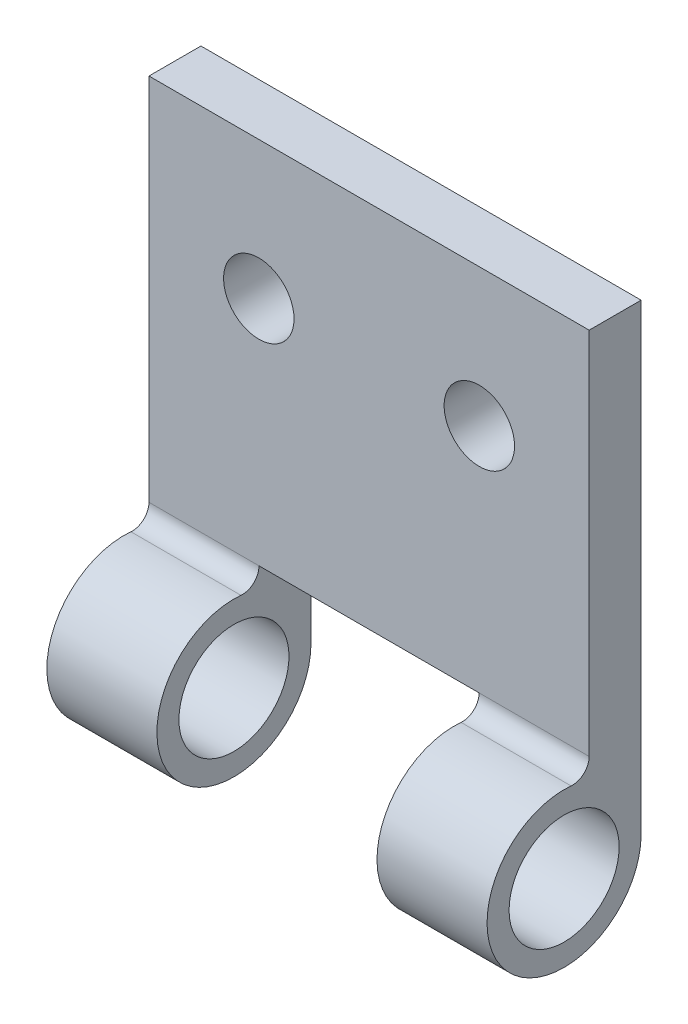
ISO-10303-21;
HEADER;
FILE_DESCRIPTION(('STEP AP214'),'2;1');
FILE_NAME('part.step','',(''),(''),'','','');
FILE_SCHEMA(('AUTOMOTIVE_DESIGN { 1 0 10303 214 1 1 1 1 }'));
ENDSEC;
DATA;
#1=APPLICATION_CONTEXT('core data for automotive mechanical design processes');
#2=APPLICATION_PROTOCOL_DEFINITION('international standard','automotive_design',2000,#1);
#3=PRODUCT_CONTEXT('',#1,'mechanical');
#4=PRODUCT('Part','Part','',(#3));
#5=PRODUCT_RELATED_PRODUCT_CATEGORY('part','',(#4));
#6=PRODUCT_DEFINITION_FORMATION('','',#4);
#7=PRODUCT_DEFINITION_CONTEXT('part definition',#1,'design');
#8=PRODUCT_DEFINITION('design','',#6,#7);
#9=PRODUCT_DEFINITION_SHAPE('','',#8);
#10=(LENGTH_UNIT() NAMED_UNIT(*) SI_UNIT(.MILLI.,.METRE.));
#11=(NAMED_UNIT(*) PLANE_ANGLE_UNIT() SI_UNIT($,.RADIAN.));
#12=(NAMED_UNIT(*) SI_UNIT($,.STERADIAN.) SOLID_ANGLE_UNIT());
#13=UNCERTAINTY_MEASURE_WITH_UNIT(LENGTH_MEASURE(1.E-05),#10,'distance_accuracy_value','');
#14=(GEOMETRIC_REPRESENTATION_CONTEXT(3) GLOBAL_UNCERTAINTY_ASSIGNED_CONTEXT((#13)) GLOBAL_UNIT_ASSIGNED_CONTEXT((#10,
#11,#12)) REPRESENTATION_CONTEXT('',''));
#15=CARTESIAN_POINT('',(0.,0.,0.));
#16=DIRECTION('',(0.,0.,1.));
#17=DIRECTION('',(1.,0.,0.));
#18=AXIS2_PLACEMENT_3D('',#15,#16,#17);
#19=CARTESIAN_POINT('',(25.4,-4.25445376136509,1.65863756820272));
#20=DIRECTION('',(-1.,0.,0.));
#21=DIRECTION('',(0.,0.,1.));
#22=AXIS2_PLACEMENT_3D('',#19,#20,#21);
#23=CYLINDRICAL_SURFACE('',#22,1.43383967509494);
#24=CARTESIAN_POINT('',(15.875,-4.25445376136509,1.65863756820272));
#25=DIRECTION('',(-1.,0.,0.));
#26=DIRECTION('',(0.,0.,1.));
#27=AXIS2_PLACEMENT_3D('',#24,#25,#26);
#28=CIRCLE('',#27,1.43383967509494);
#29=CARTESIAN_POINT('',(15.875,-5.68235618662942,1.78898662957499));
#30=VERTEX_POINT('',#29);
#31=CARTESIAN_POINT('',(15.875,-4.25445376136509,0.224797893107779));
#32=VERTEX_POINT('',#31);
#33=EDGE_CURVE('E194',#30,#32,#28,.F.);
#34=ORIENTED_EDGE('',*,*,#33,.F.);
#35=DIRECTION('',(-1.,0.,0.));
#36=VECTOR('',#35,1.);
#37=CARTESIAN_POINT('',(25.4,-5.68235618662942,1.78898662957499));
#38=LINE('',#37,#36);
#39=CARTESIAN_POINT('',(25.4,-5.68235618662942,1.78898662957499));
#40=VERTEX_POINT('',#39);
#41=EDGE_CURVE('E11',#40,#30,#38,.T.);
#42=ORIENTED_EDGE('',*,*,#41,.F.);
#43=CARTESIAN_POINT('',(25.4,-4.25445376136509,1.65863756820272));
#44=DIRECTION('',(-1.,0.,0.));
#45=DIRECTION('',(0.,0.,1.));
#46=AXIS2_PLACEMENT_3D('',#43,#44,#45);
#47=CIRCLE('',#46,1.43383967509494);
#48=CARTESIAN_POINT('',(25.4,-4.25445376136509,0.224797893107779));
#49=VERTEX_POINT('',#48);
#50=EDGE_CURVE('E151',#49,#40,#47,.T.);
#51=ORIENTED_EDGE('',*,*,#50,.F.);
#52=DIRECTION('',(-1.,0.,0.));
#53=VECTOR('',#52,1.);
#54=CARTESIAN_POINT('',(25.4,-4.25445376136509,0.224797893107779));
#55=LINE('',#54,#53);
#56=EDGE_CURVE('E152',#49,#32,#55,.T.);
#57=ORIENTED_EDGE('',*,*,#56,.T.);
#58=EDGE_LOOP('',(#34,#42,#51,#57));
#59=FACE_BOUND('',#58,.T.);
#60=ADVANCED_FACE('F38',(#59),#23,.F.);
#61=CARTESIAN_POINT('',(25.4,-12.3222473723852,2.39512299321135));
#62=DIRECTION('',(-1.,0.,0.));
#63=DIRECTION('',(0.,0.,1.));
#64=AXIS2_PLACEMENT_3D('',#61,#62,#63);
#65=CYLINDRICAL_SURFACE('',#64,6.6675);
#66=CARTESIAN_POINT('',(15.875,-12.3222473723852,2.39512299321135));
#67=DIRECTION('',(-1.,0.,0.));
#68=DIRECTION('',(0.,0.,1.));
#69=AXIS2_PLACEMENT_3D('',#66,#67,#68);
#70=CIRCLE('',#69,6.6675);
#71=CARTESIAN_POINT('',(15.875,-12.3222473723852,-4.27237700678864));
#72=VERTEX_POINT('',#71);
#73=EDGE_CURVE('E190',#72,#30,#70,.T.);
#74=ORIENTED_EDGE('',*,*,#73,.F.);
#75=DIRECTION('',(-1.,0.,0.));
#76=VECTOR('',#75,1.);
#77=CARTESIAN_POINT('',(25.4,-12.3222473723852,-4.27237700678864));
#78=LINE('',#77,#76);
#79=CARTESIAN_POINT('',(25.4,-12.3222473723852,-4.27237700678864));
#80=VERTEX_POINT('',#79);
#81=EDGE_CURVE('E159',#80,#72,#78,.T.);
#82=ORIENTED_EDGE('',*,*,#81,.F.);
#83=CARTESIAN_POINT('',(25.4,-12.3222473723852,2.39512299321135));
#84=DIRECTION('',(1.,0.,0.));
#85=DIRECTION('',(0.,0.,-1.));
#86=AXIS2_PLACEMENT_3D('',#83,#84,#85);
#87=CIRCLE('',#86,6.6675);
#88=EDGE_CURVE('E98',#40,#80,#87,.T.);
#89=ORIENTED_EDGE('',*,*,#88,.F.);
#90=ORIENTED_EDGE('',*,*,#41,.T.);
#91=EDGE_LOOP('',(#74,#82,#89,#90));
#92=FACE_BOUND('',#91,.T.);
#93=ADVANCED_FACE('F248',(#92),#65,.T.);
#94=CARTESIAN_POINT('',(25.4,-12.3222473723852,-4.27237700678864));
#95=DIRECTION('',(0.,0.,1.));
#96=DIRECTION('',(1.,0.,0.));
#97=AXIS2_PLACEMENT_3D('',#94,#95,#96);
#98=PLANE('',#97);
#99=CARTESIAN_POINT('',(15.8934195363055,15.7701911998458,-4.27237700678864));
#100=DIRECTION('',(0.,0.,1.));
#101=DIRECTION('',(1.,0.,0.));
#102=AXIS2_PLACEMENT_3D('',#99,#100,#101);
#103=CIRCLE('',#102,3.048);
#104=CARTESIAN_POINT('',(18.9414195363055,15.7701911998458,-4.27237700678864));
#105=VERTEX_POINT('',#104);
#106=EDGE_CURVE('E206',#105,#105,#103,.T.);
#107=ORIENTED_EDGE('',*,*,#106,.T.);
#108=EDGE_LOOP('',(#107));
#109=FACE_BOUND('',#108,.T.);
#110=CARTESIAN_POINT('',(-3.19341953630549,15.7701911998458,-4.27237700678864));
#111=DIRECTION('',(0.,0.,1.));
#112=DIRECTION('',(1.,0.,0.));
#113=AXIS2_PLACEMENT_3D('',#110,#111,#112);
#114=CIRCLE('',#113,3.048);
#115=CARTESIAN_POINT('',(-0.14541953630549,15.7701911998458,-4.27237700678864));
#116=VERTEX_POINT('',#115);
#117=EDGE_CURVE('E213',#116,#116,#114,.T.);
#118=ORIENTED_EDGE('',*,*,#117,.T.);
#119=EDGE_LOOP('',(#118));
#120=FACE_BOUND('',#119,.T.);
#121=DIRECTION('',(0.,-1.,0.));
#122=VECTOR('',#121,1.);
#123=CARTESIAN_POINT('',(15.875,-12.3222473723852,-4.27237700678864));
#124=LINE('',#123,#122);
#125=CARTESIAN_POINT('',(15.875,-4.25445376136509,-4.27237700678864));
#126=VERTEX_POINT('',#125);
#127=EDGE_CURVE('E187',#126,#72,#124,.T.);
#128=ORIENTED_EDGE('',*,*,#127,.F.);
#129=DIRECTION('',(-1.,0.,0.));
#130=VECTOR('',#129,1.);
#131=CARTESIAN_POINT('',(25.4,-4.25445376136509,-4.27237700678864));
#132=LINE('',#131,#130);
#133=CARTESIAN_POINT('',(-3.17499999999999,-4.25445376136509,-4.27237700678864));
#134=VERTEX_POINT('',#133);
#135=EDGE_CURVE('E197',#126,#134,#132,.T.);
#136=ORIENTED_EDGE('',*,*,#135,.T.);
#137=DIRECTION('',(0.,-1.,0.));
#138=VECTOR('',#137,1.);
#139=CARTESIAN_POINT('',(-3.17499999999999,-12.3222473723852,-4.27237700678864));
#140=LINE('',#139,#138);
#141=CARTESIAN_POINT('',(-3.17499999999999,-12.3222473723852,-4.27237700678864));
#142=VERTEX_POINT('',#141);
#143=EDGE_CURVE('E164',#134,#142,#140,.T.);
#144=ORIENTED_EDGE('',*,*,#143,.T.);
#145=CARTESIAN_POINT('',(-12.7,-12.3222473723852,-4.27237700678864));
#146=VERTEX_POINT('',#145);
#147=EDGE_CURVE('E124',#142,#146,#78,.T.);
#148=ORIENTED_EDGE('',*,*,#147,.T.);
#149=DIRECTION('',(0.,1.,0.));
#150=VECTOR('',#149,1.);
#151=CARTESIAN_POINT('',(-12.7,-12.3222473723852,-4.27237700678864));
#152=LINE('',#151,#150);
#153=CARTESIAN_POINT('',(-12.7,27.6981687541523,-4.27237700678864));
#154=VERTEX_POINT('',#153);
#155=EDGE_CURVE('E120',#146,#154,#152,.T.);
#156=ORIENTED_EDGE('',*,*,#155,.T.);
#157=DIRECTION('',(-1.,0.,0.));
#158=VECTOR('',#157,1.);
#159=CARTESIAN_POINT('',(25.4,27.6981687541523,-4.27237700678864));
#160=LINE('',#159,#158);
#161=CARTESIAN_POINT('',(25.4,27.6981687541523,-4.27237700678864));
#162=VERTEX_POINT('',#161);
#163=EDGE_CURVE('E116',#162,#154,#160,.T.);
#164=ORIENTED_EDGE('',*,*,#163,.F.);
#165=DIRECTION('',(0.,1.,0.));
#166=VECTOR('',#165,1.);
#167=CARTESIAN_POINT('',(25.4,-12.3222473723852,-4.27237700678864));
#168=LINE('',#167,#166);
#169=EDGE_CURVE('E104',#80,#162,#168,.T.);
#170=ORIENTED_EDGE('',*,*,#169,.F.);
#171=ORIENTED_EDGE('',*,*,#81,.T.);
#172=EDGE_LOOP('',(#128,#136,#144,#148,#156,#164,#170,#171));
#173=FACE_BOUND('',#172,.T.);
#174=ADVANCED_FACE('F118',(#109,#120,#173),#98,.F.);
#175=CARTESIAN_POINT('',(25.4,-12.3222473723852,2.39512299321135));
#176=DIRECTION('',(-1.,0.,0.));
#177=DIRECTION('',(0.,0.,1.));
#178=AXIS2_PLACEMENT_3D('',#175,#176,#177);
#179=CYLINDRICAL_SURFACE('',#178,4.7625);
#180=CARTESIAN_POINT('',(25.4,-12.3222473723852,2.39512299321135));
#181=DIRECTION('',(1.,0.,0.));
#182=DIRECTION('',(0.,0.,-1.));
#183=AXIS2_PLACEMENT_3D('',#180,#181,#182);
#184=CIRCLE('',#183,4.7625);
#185=CARTESIAN_POINT('',(25.4,-12.3222473723852,-2.36737700678865));
#186=VERTEX_POINT('',#185);
#187=EDGE_CURVE('E139',#186,#186,#184,.T.);
#188=ORIENTED_EDGE('',*,*,#187,.T.);
#189=EDGE_LOOP('',(#188));
#190=FACE_BOUND('',#189,.T.);
#191=CARTESIAN_POINT('',(15.875,-12.3222473723852,2.39512299321135));
#192=DIRECTION('',(-1.,0.,0.));
#193=DIRECTION('',(0.,0.,1.));
#194=AXIS2_PLACEMENT_3D('',#191,#192,#193);
#195=CIRCLE('',#194,4.7625);
#196=CARTESIAN_POINT('',(15.875,-12.3222473723852,7.15762299321135));
#197=VERTEX_POINT('',#196);
#198=EDGE_CURVE('E42',#197,#197,#195,.T.);
#199=ORIENTED_EDGE('',*,*,#198,.T.);
#200=EDGE_LOOP('',(#199));
#201=FACE_BOUND('',#200,.T.);
#202=ADVANCED_FACE('F230',(#190,#201),#179,.F.);
#203=CARTESIAN_POINT('',(25.4,-4.25445376136509,1.65863756820272));
#204=DIRECTION('',(-1.,0.,0.));
#205=DIRECTION('',(0.,0.,1.));
#206=AXIS2_PLACEMENT_3D('',#203,#204,#205);
#207=PLANE('',#206);
#208=ORIENTED_EDGE('',*,*,#50,.T.);
#209=ORIENTED_EDGE('',*,*,#88,.T.);
#210=ORIENTED_EDGE('',*,*,#169,.T.);
#211=DIRECTION('',(0.,0.,1.));
#212=VECTOR('',#211,1.);
#213=CARTESIAN_POINT('',(25.4,27.6981687541523,-4.27237700678864));
#214=LINE('',#213,#212);
#215=CARTESIAN_POINT('',(25.4,27.6981687541523,0.224797893107779));
#216=VERTEX_POINT('',#215);
#217=EDGE_CURVE('E109',#162,#216,#214,.T.);
#218=ORIENTED_EDGE('',*,*,#217,.T.);
#219=DIRECTION('',(0.,-1.,0.));
#220=VECTOR('',#219,1.);
#221=CARTESIAN_POINT('',(25.4,-4.25445376136509,0.224797893107779));
#222=LINE('',#221,#220);
#223=EDGE_CURVE('E65',#216,#49,#222,.T.);
#224=ORIENTED_EDGE('',*,*,#223,.T.);
#225=EDGE_LOOP('',(#208,#209,#210,#218,#224));
#226=FACE_BOUND('',#225,.T.);
#227=ORIENTED_EDGE('',*,*,#187,.F.);
#228=EDGE_LOOP('',(#227));
#229=FACE_BOUND('',#228,.T.);
#230=ADVANCED_FACE('F106',(#226,#229),#207,.F.);
#231=CARTESIAN_POINT('',(-12.7,-4.25445376136509,1.65863756820272));
#232=DIRECTION('',(-1.,0.,0.));
#233=DIRECTION('',(0.,0.,1.));
#234=AXIS2_PLACEMENT_3D('',#231,#232,#233);
#235=PLANE('',#234);
#236=CARTESIAN_POINT('',(-12.7,-4.25445376136509,1.65863756820272));
#237=DIRECTION('',(-1.,0.,0.));
#238=DIRECTION('',(0.,0.,1.));
#239=AXIS2_PLACEMENT_3D('',#236,#237,#238);
#240=CIRCLE('',#239,1.43383967509494);
#241=CARTESIAN_POINT('',(-12.7,-4.25445376136509,0.224797893107779));
#242=VERTEX_POINT('',#241);
#243=CARTESIAN_POINT('',(-12.7,-5.68235618662942,1.78898662957499));
#244=VERTEX_POINT('',#243);
#245=EDGE_CURVE('E135',#242,#244,#240,.T.);
#246=ORIENTED_EDGE('',*,*,#245,.F.);
#247=DIRECTION('',(0.,-1.,0.));
#248=VECTOR('',#247,1.);
#249=CARTESIAN_POINT('',(-12.7,-4.25445376136509,0.224797893107779));
#250=LINE('',#249,#248);
#251=CARTESIAN_POINT('',(-12.7,27.6981687541523,0.224797893107779));
#252=VERTEX_POINT('',#251);
#253=EDGE_CURVE('E148',#252,#242,#250,.T.);
#254=ORIENTED_EDGE('',*,*,#253,.F.);
#255=DIRECTION('',(0.,0.,1.));
#256=VECTOR('',#255,1.);
#257=CARTESIAN_POINT('',(-12.7,27.6981687541523,-4.27237700678864));
#258=LINE('',#257,#256);
#259=EDGE_CURVE('E145',#154,#252,#258,.T.);
#260=ORIENTED_EDGE('',*,*,#259,.F.);
#261=ORIENTED_EDGE('',*,*,#155,.F.);
#262=CARTESIAN_POINT('',(-12.7,-12.3222473723852,2.39512299321135));
#263=DIRECTION('',(1.,0.,0.));
#264=DIRECTION('',(0.,0.,-1.));
#265=AXIS2_PLACEMENT_3D('',#262,#263,#264);
#266=CIRCLE('',#265,6.6675);
#267=EDGE_CURVE('E138',#244,#146,#266,.T.);
#268=ORIENTED_EDGE('',*,*,#267,.F.);
#269=EDGE_LOOP('',(#246,#254,#260,#261,#268));
#270=FACE_BOUND('',#269,.T.);
#271=CARTESIAN_POINT('',(-12.7,-12.3222473723852,2.39512299321135));
#272=DIRECTION('',(1.,0.,0.));
#273=DIRECTION('',(0.,0.,-1.));
#274=AXIS2_PLACEMENT_3D('',#271,#272,#273);
#275=CIRCLE('',#274,4.7625);
#276=CARTESIAN_POINT('',(-12.7,-12.3222473723852,-2.36737700678865));
#277=VERTEX_POINT('',#276);
#278=EDGE_CURVE('E217',#277,#277,#275,.T.);
#279=ORIENTED_EDGE('',*,*,#278,.T.);
#280=EDGE_LOOP('',(#279));
#281=FACE_BOUND('',#280,.T.);
#282=ADVANCED_FACE('F279',(#270,#281),#235,.T.);
#283=CARTESIAN_POINT('',(-3.17499999999999,-5.68235618662942,1.78898662957499));
#284=VERTEX_POINT('',#283);
#285=EDGE_CURVE('E48',#284,#244,#38,.T.);
#286=ORIENTED_EDGE('',*,*,#285,.F.);
#287=CARTESIAN_POINT('',(-3.17499999999999,-4.25445376136509,1.65863756820272));
#288=DIRECTION('',(-1.,0.,0.));
#289=DIRECTION('',(0.,0.,1.));
#290=AXIS2_PLACEMENT_3D('',#287,#288,#289);
#291=CIRCLE('',#290,1.43383967509494);
#292=CARTESIAN_POINT('',(-3.17499999999999,-4.25445376136509,0.224797893107779));
#293=VERTEX_POINT('',#292);
#294=EDGE_CURVE('E184',#284,#293,#291,.F.);
#295=ORIENTED_EDGE('',*,*,#294,.T.);
#296=EDGE_CURVE('E90',#293,#242,#55,.T.);
#297=ORIENTED_EDGE('',*,*,#296,.T.);
#298=ORIENTED_EDGE('',*,*,#245,.T.);
#299=EDGE_LOOP('',(#286,#295,#297,#298));
#300=FACE_BOUND('',#299,.T.);
#301=ADVANCED_FACE('F40',(#300),#23,.F.);
#302=ORIENTED_EDGE('',*,*,#147,.F.);
#303=CARTESIAN_POINT('',(-3.17499999999999,-12.3222473723852,2.39512299321135));
#304=DIRECTION('',(-1.,0.,0.));
#305=DIRECTION('',(0.,0.,1.));
#306=AXIS2_PLACEMENT_3D('',#303,#304,#305);
#307=CIRCLE('',#306,6.6675);
#308=EDGE_CURVE('E170',#142,#284,#307,.T.);
#309=ORIENTED_EDGE('',*,*,#308,.T.);
#310=ORIENTED_EDGE('',*,*,#285,.T.);
#311=ORIENTED_EDGE('',*,*,#267,.T.);
#312=EDGE_LOOP('',(#302,#309,#310,#311));
#313=FACE_BOUND('',#312,.T.);
#314=ADVANCED_FACE('F277',(#313),#65,.T.);
#315=CARTESIAN_POINT('',(25.4,27.6981687541523,-4.27237700678864));
#316=DIRECTION('',(0.,-1.,0.));
#317=DIRECTION('',(0.,0.,-1.));
#318=AXIS2_PLACEMENT_3D('',#315,#316,#317);
#319=PLANE('',#318);
#320=ORIENTED_EDGE('',*,*,#259,.T.);
#321=DIRECTION('',(-1.,0.,0.));
#322=VECTOR('',#321,1.);
#323=CARTESIAN_POINT('',(25.4,27.6981687541523,0.224797893107779));
#324=LINE('',#323,#322);
#325=EDGE_CURVE('E125',#216,#252,#324,.T.);
#326=ORIENTED_EDGE('',*,*,#325,.F.);
#327=ORIENTED_EDGE('',*,*,#217,.F.);
#328=ORIENTED_EDGE('',*,*,#163,.T.);
#329=EDGE_LOOP('',(#320,#326,#327,#328));
#330=FACE_BOUND('',#329,.T.);
#331=ADVANCED_FACE('F127',(#330),#319,.F.);
#332=CARTESIAN_POINT('',(25.4,-4.25445376136509,0.224797893107779));
#333=DIRECTION('',(0.,0.,-1.));
#334=DIRECTION('',(-1.,0.,0.));
#335=AXIS2_PLACEMENT_3D('',#332,#333,#334);
#336=PLANE('',#335);
#337=CARTESIAN_POINT('',(-3.19341953630549,15.7701911998458,0.224797893107779));
#338=DIRECTION('',(0.,0.,1.));
#339=DIRECTION('',(1.,0.,0.));
#340=AXIS2_PLACEMENT_3D('',#337,#338,#339);
#341=CIRCLE('',#340,3.048);
#342=CARTESIAN_POINT('',(-0.14541953630549,15.7701911998458,0.224797893107779));
#343=VERTEX_POINT('',#342);
#344=EDGE_CURVE('E202',#343,#343,#341,.T.);
#345=ORIENTED_EDGE('',*,*,#344,.F.);
#346=EDGE_LOOP('',(#345));
#347=FACE_BOUND('',#346,.T.);
#348=CARTESIAN_POINT('',(15.8934195363055,15.7701911998458,0.224797893107779));
#349=DIRECTION('',(0.,0.,1.));
#350=DIRECTION('',(1.,0.,0.));
#351=AXIS2_PLACEMENT_3D('',#348,#349,#350);
#352=CIRCLE('',#351,3.048);
#353=CARTESIAN_POINT('',(18.9414195363055,15.7701911998458,0.224797893107779));
#354=VERTEX_POINT('',#353);
#355=EDGE_CURVE('E201',#354,#354,#352,.T.);
#356=ORIENTED_EDGE('',*,*,#355,.F.);
#357=EDGE_LOOP('',(#356));
#358=FACE_BOUND('',#357,.T.);
#359=ORIENTED_EDGE('',*,*,#253,.T.);
#360=ORIENTED_EDGE('',*,*,#296,.F.);
#361=EDGE_CURVE('E156',#32,#293,#55,.T.);
#362=ORIENTED_EDGE('',*,*,#361,.F.);
#363=ORIENTED_EDGE('',*,*,#56,.F.);
#364=ORIENTED_EDGE('',*,*,#223,.F.);
#365=ORIENTED_EDGE('',*,*,#325,.T.);
#366=EDGE_LOOP('',(#359,#360,#362,#363,#364,#365));
#367=FACE_BOUND('',#366,.T.);
#368=ADVANCED_FACE('F243',(#347,#358,#367),#336,.F.);
#369=CARTESIAN_POINT('',(-3.17499999999999,-12.3222473723852,2.39512299321135));
#370=DIRECTION('',(-1.,0.,0.));
#371=DIRECTION('',(0.,0.,1.));
#372=AXIS2_PLACEMENT_3D('',#369,#370,#371);
#373=CIRCLE('',#372,4.7625);
#374=CARTESIAN_POINT('',(-3.17499999999999,-12.3222473723852,7.15762299321135));
#375=VERTEX_POINT('',#374);
#376=EDGE_CURVE('E161',#375,#375,#373,.T.);
#377=ORIENTED_EDGE('',*,*,#376,.F.);
#378=EDGE_LOOP('',(#377));
#379=FACE_BOUND('',#378,.T.);
#380=ORIENTED_EDGE('',*,*,#278,.F.);
#381=EDGE_LOOP('',(#380));
#382=FACE_BOUND('',#381,.T.);
#383=ADVANCED_FACE('F297',(#379,#382),#179,.F.);
#384=CARTESIAN_POINT('',(15.8934195363055,15.7701911998458,-37.8752021068922));
#385=DIRECTION('',(0.,0.,1.));
#386=DIRECTION('',(1.,0.,0.));
#387=AXIS2_PLACEMENT_3D('',#384,#385,#386);
#388=CYLINDRICAL_SURFACE('',#387,3.048);
#389=ORIENTED_EDGE('',*,*,#355,.T.);
#390=EDGE_LOOP('',(#389));
#391=FACE_BOUND('',#390,.T.);
#392=ORIENTED_EDGE('',*,*,#106,.F.);
#393=EDGE_LOOP('',(#392));
#394=FACE_BOUND('',#393,.T.);
#395=ADVANCED_FACE('F269',(#391,#394),#388,.F.);
#396=CARTESIAN_POINT('',(-3.19341953630549,15.7701911998458,-37.8752021068922));
#397=DIRECTION('',(0.,0.,1.));
#398=DIRECTION('',(1.,0.,0.));
#399=AXIS2_PLACEMENT_3D('',#396,#397,#398);
#400=CYLINDRICAL_SURFACE('',#399,3.048);
#401=ORIENTED_EDGE('',*,*,#344,.T.);
#402=EDGE_LOOP('',(#401));
#403=FACE_BOUND('',#402,.T.);
#404=ORIENTED_EDGE('',*,*,#117,.F.);
#405=EDGE_LOOP('',(#404));
#406=FACE_BOUND('',#405,.T.);
#407=ADVANCED_FACE('F264',(#403,#406),#400,.F.);
#408=CARTESIAN_POINT('',(-3.17499999999999,-4.25445376136509,15.4647978931078));
#409=DIRECTION('',(0.,1.,0.));
#410=DIRECTION('',(0.,0.,1.));
#411=AXIS2_PLACEMENT_3D('',#408,#409,#410);
#412=PLANE('',#411);
#413=DIRECTION('',(0.,0.,-1.));
#414=VECTOR('',#413,1.);
#415=CARTESIAN_POINT('',(15.875,-4.25445376136509,15.4647978931078));
#416=LINE('',#415,#414);
#417=EDGE_CURVE('E56',#32,#126,#416,.T.);
#418=ORIENTED_EDGE('',*,*,#417,.F.);
#419=ORIENTED_EDGE('',*,*,#361,.T.);
#420=DIRECTION('',(0.,0.,-1.));
#421=VECTOR('',#420,1.);
#422=CARTESIAN_POINT('',(-3.17499999999999,-4.25445376136509,15.4647978931078));
#423=LINE('',#422,#421);
#424=EDGE_CURVE('E172',#293,#134,#423,.T.);
#425=ORIENTED_EDGE('',*,*,#424,.T.);
#426=ORIENTED_EDGE('',*,*,#135,.F.);
#427=EDGE_LOOP('',(#418,#419,#425,#426));
#428=FACE_BOUND('',#427,.T.);
#429=ADVANCED_FACE('F235',(#428),#412,.F.);
#430=CARTESIAN_POINT('',(15.875,-18.9897473723852,15.4647978931078));
#431=DIRECTION('',(-1.,0.,0.));
#432=DIRECTION('',(0.,0.,1.));
#433=AXIS2_PLACEMENT_3D('',#430,#431,#432);
#434=PLANE('',#433);
#435=ORIENTED_EDGE('',*,*,#198,.F.);
#436=EDGE_LOOP('',(#435));
#437=FACE_BOUND('',#436,.T.);
#438=ORIENTED_EDGE('',*,*,#33,.T.);
#439=ORIENTED_EDGE('',*,*,#417,.T.);
#440=ORIENTED_EDGE('',*,*,#127,.T.);
#441=ORIENTED_EDGE('',*,*,#73,.T.);
#442=EDGE_LOOP('',(#438,#439,#440,#441));
#443=FACE_BOUND('',#442,.T.);
#444=ADVANCED_FACE('F232',(#437,#443),#434,.T.);
#445=CARTESIAN_POINT('',(-3.17499999999999,-18.9897473723852,15.4647978931078));
#446=DIRECTION('',(-1.,0.,0.));
#447=DIRECTION('',(0.,0.,1.));
#448=AXIS2_PLACEMENT_3D('',#445,#446,#447);
#449=PLANE('',#448);
#450=ORIENTED_EDGE('',*,*,#376,.T.);
#451=EDGE_LOOP('',(#450));
#452=FACE_BOUND('',#451,.T.);
#453=ORIENTED_EDGE('',*,*,#308,.F.);
#454=ORIENTED_EDGE('',*,*,#143,.F.);
#455=ORIENTED_EDGE('',*,*,#424,.F.);
#456=ORIENTED_EDGE('',*,*,#294,.F.);
#457=EDGE_LOOP('',(#453,#454,#455,#456));
#458=FACE_BOUND('',#457,.T.);
#459=ADVANCED_FACE('F234',(#452,#458),#449,.F.);
#460=CLOSED_SHELL('',(#60,#93,#174,#202,#230,#282,#301,#314,#331,#368,#383,#395,#407,#429,#444,#459));
#461=MANIFOLD_SOLID_BREP('B2',#460);
#462=ADVANCED_BREP_SHAPE_REPRESENTATION('',(#18,#461),#14);
#463=SHAPE_DEFINITION_REPRESENTATION(#9,#462);
ENDSEC;
END-ISO-10303-21;
